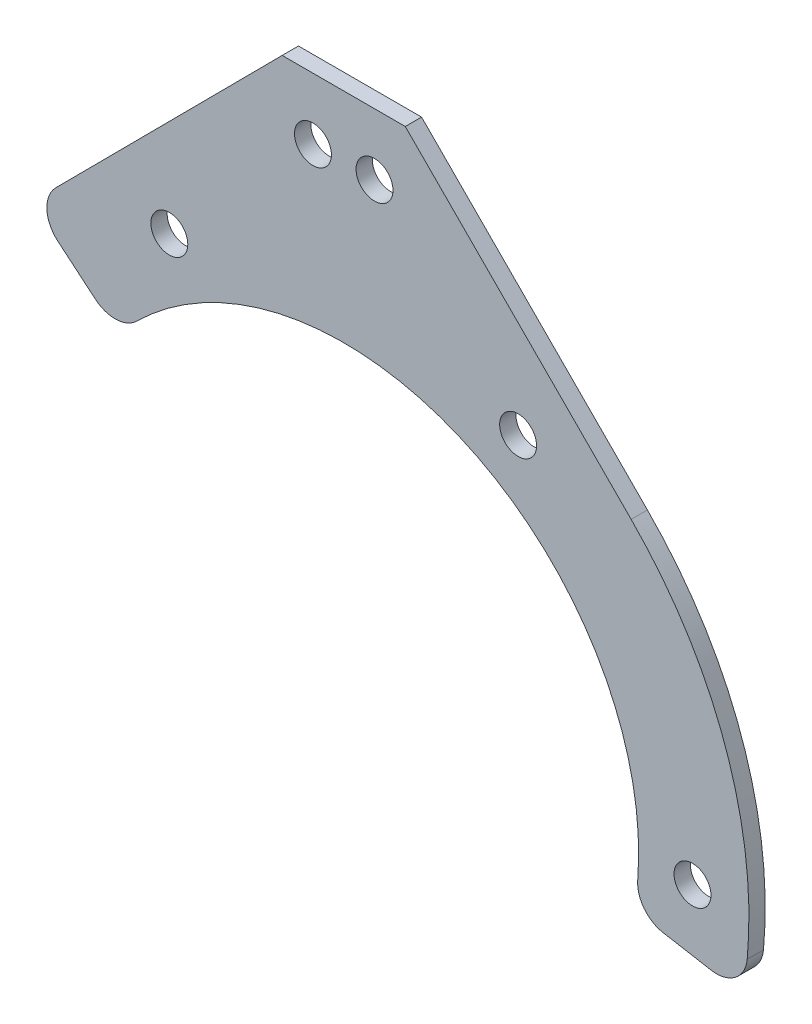
ISO-10303-21;
HEADER;
FILE_DESCRIPTION(('STEP AP214'),'2;1');
FILE_NAME('part.step','',(''),(''),'','','');
FILE_SCHEMA(('AUTOMOTIVE_DESIGN { 1 0 10303 214 1 1 1 1 }'));
ENDSEC;
DATA;
#1=APPLICATION_CONTEXT('core data for automotive mechanical design processes');
#2=APPLICATION_PROTOCOL_DEFINITION('international standard','automotive_design',2000,#1);
#3=PRODUCT_CONTEXT('',#1,'mechanical');
#4=PRODUCT('Part','Part','',(#3));
#5=PRODUCT_RELATED_PRODUCT_CATEGORY('part','',(#4));
#6=PRODUCT_DEFINITION_FORMATION('','',#4);
#7=PRODUCT_DEFINITION_CONTEXT('part definition',#1,'design');
#8=PRODUCT_DEFINITION('design','',#6,#7);
#9=PRODUCT_DEFINITION_SHAPE('','',#8);
#10=(LENGTH_UNIT() NAMED_UNIT(*) SI_UNIT(.MILLI.,.METRE.));
#11=(NAMED_UNIT(*) PLANE_ANGLE_UNIT() SI_UNIT($,.RADIAN.));
#12=(NAMED_UNIT(*) SI_UNIT($,.STERADIAN.) SOLID_ANGLE_UNIT());
#13=UNCERTAINTY_MEASURE_WITH_UNIT(LENGTH_MEASURE(1.E-05),#10,'distance_accuracy_value','');
#14=(GEOMETRIC_REPRESENTATION_CONTEXT(3) GLOBAL_UNCERTAINTY_ASSIGNED_CONTEXT((#13)) GLOBAL_UNIT_ASSIGNED_CONTEXT((#10,
#11,#12)) REPRESENTATION_CONTEXT('',''));
#15=CARTESIAN_POINT('',(0.,0.,0.));
#16=DIRECTION('',(0.,0.,1.));
#17=DIRECTION('',(1.,0.,0.));
#18=AXIS2_PLACEMENT_3D('',#15,#16,#17);
#19=CARTESIAN_POINT('',(0.,0.,0.79375));
#20=DIRECTION('',(0.,0.,-1.));
#21=DIRECTION('',(-1.,0.,0.));
#22=AXIS2_PLACEMENT_3D('',#19,#20,#21);
#23=CYLINDRICAL_SURFACE('',#22,39.5);
#24=CARTESIAN_POINT('',(0.,0.,-0.79375));
#25=DIRECTION('',(0.,0.,1.));
#26=DIRECTION('',(1.,0.,0.));
#27=AXIS2_PLACEMENT_3D('',#24,#25,#26);
#28=CIRCLE('',#27,39.5);
#29=CARTESIAN_POINT('',(-28.0183634295651,27.8427963884522,-0.79375));
#30=VERTEX_POINT('',#29);
#31=CARTESIAN_POINT('',(-28.0695175577032,27.7912249474144,-0.79375));
#32=VERTEX_POINT('',#31);
#33=EDGE_CURVE('E141',#30,#32,#28,.T.);
#34=ORIENTED_EDGE('',*,*,#33,.T.);
#35=DIRECTION('',(0.,0.,-1.));
#36=VECTOR('',#35,1.);
#37=CARTESIAN_POINT('',(-28.0695175577032,27.7912249474144,0.79375));
#38=LINE('',#37,#36);
#39=CARTESIAN_POINT('',(-28.0695175577032,27.7912249474144,0.79375));
#40=VERTEX_POINT('',#39);
#41=EDGE_CURVE('E11',#32,#40,#38,.F.);
#42=ORIENTED_EDGE('',*,*,#41,.T.);
#43=CARTESIAN_POINT('',(0.,0.,0.79375));
#44=DIRECTION('',(0.,0.,1.));
#45=DIRECTION('',(1.,0.,0.));
#46=AXIS2_PLACEMENT_3D('',#43,#44,#45);
#47=CIRCLE('',#46,39.5);
#48=CARTESIAN_POINT('',(-28.0183634295652,27.8427963884522,0.79375));
#49=VERTEX_POINT('',#48);
#50=EDGE_CURVE('E178',#49,#40,#47,.T.);
#51=ORIENTED_EDGE('',*,*,#50,.F.);
#52=DIRECTION('',(0.,0.,1.));
#53=VECTOR('',#52,1.);
#54=CARTESIAN_POINT('',(-28.0183634295651,27.8427963884522,-0.79375));
#55=LINE('',#54,#53);
#56=EDGE_CURVE('E142',#30,#49,#55,.T.);
#57=ORIENTED_EDGE('',*,*,#56,.F.);
#58=EDGE_LOOP('',(#34,#42,#51,#57));
#59=FACE_BOUND('',#58,.T.);
#60=ADVANCED_FACE('F40',(#59),#23,.T.);
#61=CARTESIAN_POINT('',(39.3320515344067,-3.63864289189977,0.79375));
#62=VERTEX_POINT('',#61);
#63=CARTESIAN_POINT('',(28.0183634295651,27.8427963884522,0.79375));
#64=VERTEX_POINT('',#63);
#65=EDGE_CURVE('E179',#62,#64,#47,.T.);
#66=ORIENTED_EDGE('',*,*,#65,.F.);
#67=DIRECTION('',(0.,0.,-1.));
#68=VECTOR('',#67,1.);
#69=CARTESIAN_POINT('',(39.3320515344067,-3.63864289189977,0.79375));
#70=LINE('',#69,#68);
#71=CARTESIAN_POINT('',(39.3320515344067,-3.63864289189977,-0.79375));
#72=VERTEX_POINT('',#71);
#73=EDGE_CURVE('E138',#62,#72,#70,.T.);
#74=ORIENTED_EDGE('',*,*,#73,.T.);
#75=CARTESIAN_POINT('',(28.0183634295651,27.8427963884522,-0.79375));
#76=VERTEX_POINT('',#75);
#77=EDGE_CURVE('E132',#72,#76,#28,.T.);
#78=ORIENTED_EDGE('',*,*,#77,.T.);
#79=DIRECTION('',(0.,0.,1.));
#80=VECTOR('',#79,1.);
#81=CARTESIAN_POINT('',(28.0183634295651,27.8427963884522,-0.79375));
#82=LINE('',#81,#80);
#83=EDGE_CURVE('E136',#76,#64,#82,.T.);
#84=ORIENTED_EDGE('',*,*,#83,.T.);
#85=EDGE_LOOP('',(#66,#74,#78,#84));
#86=FACE_BOUND('',#85,.T.);
#87=ADVANCED_FACE('F135',(#86),#23,.T.);
#88=CARTESIAN_POINT('',(0.,0.,0.79375));
#89=DIRECTION('',(0.,0.,1.));
#90=DIRECTION('',(1.,0.,0.));
#91=AXIS2_PLACEMENT_3D('',#88,#89,#90);
#92=PLANE('',#91);
#93=DIRECTION('',(0.984807753012209,-0.173648177666928,0.));
#94=VECTOR('',#93,1.);
#95=CARTESIAN_POINT('',(28.313222899101,-4.99238510792417,0.79375));
#96=LINE('',#95,#94);
#97=CARTESIAN_POINT('',(31.1277541669321,-5.48866290849039,0.79375));
#98=VERTEX_POINT('',#97);
#99=CARTESIAN_POINT('',(35.8238625810713,-6.31671352623515,0.79375));
#100=VERTEX_POINT('',#99);
#101=EDGE_CURVE('E231',#98,#100,#96,.T.);
#102=ORIENTED_EDGE('',*,*,#101,.T.);
#103=CARTESIAN_POINT('',(36.344807114072,-3.36229026719852,0.79375));
#104=DIRECTION('',(0.,0.,1.));
#105=DIRECTION('',(1.,0.,0.));
#106=AXIS2_PLACEMENT_3D('',#103,#104,#105);
#107=CIRCLE('',#106,3.);
#108=EDGE_CURVE('E209',#100,#62,#107,.T.);
#109=ORIENTED_EDGE('',*,*,#108,.T.);
#110=ORIENTED_EDGE('',*,*,#65,.T.);
#111=DIRECTION('',(-0.704880921226637,0.709325656444688,0.));
#112=VECTOR('',#111,1.);
#113=CARTESIAN_POINT('',(28.0183634295651,27.8427963884522,0.79375));
#114=LINE('',#113,#112);
#115=CARTESIAN_POINT('',(6.,50.,0.79375));
#116=VERTEX_POINT('',#115);
#117=EDGE_CURVE('E150',#64,#116,#114,.T.);
#118=ORIENTED_EDGE('',*,*,#117,.T.);
#119=DIRECTION('',(-1.,0.,0.));
#120=VECTOR('',#119,1.);
#121=CARTESIAN_POINT('',(-6.,50.,0.79375));
#122=LINE('',#121,#120);
#123=CARTESIAN_POINT('',(-6.,50.,0.79375));
#124=VERTEX_POINT('',#123);
#125=EDGE_CURVE('E162',#116,#124,#122,.T.);
#126=ORIENTED_EDGE('',*,*,#125,.T.);
#127=DIRECTION('',(-0.704880921226637,-0.709325656444688,0.));
#128=VECTOR('',#127,1.);
#129=CARTESIAN_POINT('',(-28.0183634295651,27.8427963884522,0.79375));
#130=LINE('',#129,#128);
#131=EDGE_CURVE('E159',#124,#49,#130,.T.);
#132=ORIENTED_EDGE('',*,*,#131,.T.);
#133=ORIENTED_EDGE('',*,*,#50,.T.);
#134=CARTESIAN_POINT('',(-25.9376554647131,25.6804990020412,0.79375));
#135=DIRECTION('',(0.,0.,1.));
#136=DIRECTION('',(1.,0.,0.));
#137=AXIS2_PLACEMENT_3D('',#134,#135,#136);
#138=CIRCLE('',#137,3.);
#139=CARTESIAN_POINT('',(-27.8660182937727,23.3823656726843,0.79375));
#140=VERTEX_POINT('',#139);
#141=EDGE_CURVE('E205',#40,#140,#138,.T.);
#142=ORIENTED_EDGE('',*,*,#141,.T.);
#143=DIRECTION('',(0.766044443118975,-0.642787609686543,0.));
#144=VECTOR('',#143,1.);
#145=CARTESIAN_POINT('',(-22.0237777396705,18.4801437784881,0.79375));
#146=LINE('',#145,#144);
#147=CARTESIAN_POINT('',(-24.2130944170748,20.3171985950283,0.79375));
#148=VERTEX_POINT('',#147);
#149=EDGE_CURVE('E226',#140,#148,#146,.T.);
#150=ORIENTED_EDGE('',*,*,#149,.T.);
#151=CARTESIAN_POINT('',(-22.2847315880152,22.6153319243852,0.79375));
#152=DIRECTION('',(0.,0.,1.));
#153=DIRECTION('',(1.,0.,0.));
#154=AXIS2_PLACEMENT_3D('',#151,#152,#153);
#155=CIRCLE('',#154,3.);
#156=CARTESIAN_POINT('',(-20.1790876584389,20.4784501677504,0.79375));
#157=VERTEX_POINT('',#156);
#158=EDGE_CURVE('E61',#148,#157,#155,.T.);
#159=ORIENTED_EDGE('',*,*,#158,.T.);
#160=CARTESIAN_POINT('',(0.,0.,0.79375));
#161=DIRECTION('',(0.,0.,1.));
#162=DIRECTION('',(1.,0.,0.));
#163=AXIS2_PLACEMENT_3D('',#160,#161,#162);
#164=CIRCLE('',#163,28.75);
#165=CARTESIAN_POINT('',(28.6582704763172,-2.29478393454475,0.79375));
#166=VERTEX_POINT('',#165);
#167=EDGE_CURVE('E165',#166,#157,#164,.T.);
#168=ORIENTED_EDGE('',*,*,#167,.F.);
#169=CARTESIAN_POINT('',(31.6486986999329,-2.53423964945377,0.79375));
#170=DIRECTION('',(0.,0.,1.));
#171=DIRECTION('',(1.,0.,0.));
#172=AXIS2_PLACEMENT_3D('',#169,#170,#171);
#173=CIRCLE('',#172,3.);
#174=EDGE_CURVE('E207',#166,#98,#173,.T.);
#175=ORIENTED_EDGE('',*,*,#174,.T.);
#176=EDGE_LOOP('',(#102,#109,#110,#118,#126,#132,#133,#142,#150,#159,#168,#175));
#177=FACE_BOUND('',#176,.T.);
#178=CARTESIAN_POINT('',(-3.,44.,0.79375));
#179=DIRECTION('',(0.,0.,1.));
#180=DIRECTION('',(1.,0.,0.));
#181=AXIS2_PLACEMENT_3D('',#178,#179,#180);
#182=CIRCLE('',#181,1.8);
#183=CARTESIAN_POINT('',(-1.2,44.,0.79375));
#184=VERTEX_POINT('',#183);
#185=EDGE_CURVE('E189',#184,#184,#182,.T.);
#186=ORIENTED_EDGE('',*,*,#185,.F.);
#187=EDGE_LOOP('',(#186));
#188=FACE_BOUND('',#187,.T.);
#189=CARTESIAN_POINT('',(3.,44.,0.79375));
#190=DIRECTION('',(0.,0.,1.));
#191=DIRECTION('',(1.,0.,0.));
#192=AXIS2_PLACEMENT_3D('',#189,#190,#191);
#193=CIRCLE('',#192,1.8);
#194=CARTESIAN_POINT('',(4.8,44.,0.79375));
#195=VERTEX_POINT('',#194);
#196=EDGE_CURVE('E185',#195,#195,#193,.T.);
#197=ORIENTED_EDGE('',*,*,#196,.F.);
#198=EDGE_LOOP('',(#197));
#199=FACE_BOUND('',#198,.T.);
#200=CARTESIAN_POINT('',(-17.,29.4448637286709,0.79375));
#201=DIRECTION('',(0.,0.,1.));
#202=DIRECTION('',(1.,0.,0.));
#203=AXIS2_PLACEMENT_3D('',#200,#201,#202);
#204=CIRCLE('',#203,1.8);
#205=CARTESIAN_POINT('',(-15.2000000000001,29.4448637286709,0.79375));
#206=VERTEX_POINT('',#205);
#207=EDGE_CURVE('E184',#206,#206,#204,.T.);
#208=ORIENTED_EDGE('',*,*,#207,.F.);
#209=EDGE_LOOP('',(#208));
#210=FACE_BOUND('',#209,.T.);
#211=CARTESIAN_POINT('',(16.9999999999998,29.444863728671,0.79375));
#212=DIRECTION('',(0.,0.,1.));
#213=DIRECTION('',(1.,0.,0.));
#214=AXIS2_PLACEMENT_3D('',#211,#212,#213);
#215=CIRCLE('',#214,1.8);
#216=CARTESIAN_POINT('',(18.7999999999998,29.444863728671,0.79375));
#217=VERTEX_POINT('',#216);
#218=EDGE_CURVE('E249',#217,#217,#215,.T.);
#219=ORIENTED_EDGE('',*,*,#218,.F.);
#220=EDGE_LOOP('',(#219));
#221=FACE_BOUND('',#220,.T.);
#222=CARTESIAN_POINT('',(34.,1.31838984174237E-13,0.79375));
#223=DIRECTION('',(0.,0.,1.));
#224=DIRECTION('',(1.,0.,0.));
#225=AXIS2_PLACEMENT_3D('',#222,#223,#224);
#226=CIRCLE('',#225,1.8);
#227=CARTESIAN_POINT('',(35.8,1.31838984174237E-13,0.79375));
#228=VERTEX_POINT('',#227);
#229=EDGE_CURVE('E255',#228,#228,#226,.T.);
#230=ORIENTED_EDGE('',*,*,#229,.F.);
#231=EDGE_LOOP('',(#230));
#232=FACE_BOUND('',#231,.T.);
#233=ADVANCED_FACE('F267',(#177,#188,#199,#210,#221,#232),#92,.T.);
#234=CARTESIAN_POINT('',(0.,0.,-0.79375));
#235=DIRECTION('',(0.,0.,1.));
#236=DIRECTION('',(1.,0.,0.));
#237=AXIS2_PLACEMENT_3D('',#234,#235,#236);
#238=PLANE('',#237);
#239=CARTESIAN_POINT('',(-3.,44.,-0.79375));
#240=DIRECTION('',(0.,0.,1.));
#241=DIRECTION('',(1.,0.,0.));
#242=AXIS2_PLACEMENT_3D('',#239,#240,#241);
#243=CIRCLE('',#242,1.8);
#244=CARTESIAN_POINT('',(-1.2,44.,-0.79375));
#245=VERTEX_POINT('',#244);
#246=EDGE_CURVE('E186',#245,#245,#243,.T.);
#247=ORIENTED_EDGE('',*,*,#246,.T.);
#248=EDGE_LOOP('',(#247));
#249=FACE_BOUND('',#248,.T.);
#250=CARTESIAN_POINT('',(3.,44.,-0.79375));
#251=DIRECTION('',(0.,0.,1.));
#252=DIRECTION('',(1.,0.,0.));
#253=AXIS2_PLACEMENT_3D('',#250,#251,#252);
#254=CIRCLE('',#253,1.8);
#255=CARTESIAN_POINT('',(4.8,44.,-0.79375));
#256=VERTEX_POINT('',#255);
#257=EDGE_CURVE('E181',#256,#256,#254,.T.);
#258=ORIENTED_EDGE('',*,*,#257,.T.);
#259=EDGE_LOOP('',(#258));
#260=FACE_BOUND('',#259,.T.);
#261=CARTESIAN_POINT('',(-17.,29.4448637286709,-0.79375));
#262=DIRECTION('',(0.,0.,1.));
#263=DIRECTION('',(1.,0.,0.));
#264=AXIS2_PLACEMENT_3D('',#261,#262,#263);
#265=CIRCLE('',#264,1.8);
#266=CARTESIAN_POINT('',(-15.2000000000001,29.4448637286709,-0.79375));
#267=VERTEX_POINT('',#266);
#268=EDGE_CURVE('E246',#267,#267,#265,.T.);
#269=ORIENTED_EDGE('',*,*,#268,.T.);
#270=EDGE_LOOP('',(#269));
#271=FACE_BOUND('',#270,.T.);
#272=CARTESIAN_POINT('',(16.9999999999998,29.444863728671,-0.79375));
#273=DIRECTION('',(0.,0.,1.));
#274=DIRECTION('',(1.,0.,0.));
#275=AXIS2_PLACEMENT_3D('',#272,#273,#274);
#276=CIRCLE('',#275,1.8);
#277=CARTESIAN_POINT('',(18.7999999999998,29.444863728671,-0.79375));
#278=VERTEX_POINT('',#277);
#279=EDGE_CURVE('E252',#278,#278,#276,.T.);
#280=ORIENTED_EDGE('',*,*,#279,.T.);
#281=EDGE_LOOP('',(#280));
#282=FACE_BOUND('',#281,.T.);
#283=CARTESIAN_POINT('',(34.,1.31838984174237E-13,-0.79375));
#284=DIRECTION('',(0.,0.,1.));
#285=DIRECTION('',(1.,0.,0.));
#286=AXIS2_PLACEMENT_3D('',#283,#284,#285);
#287=CIRCLE('',#286,1.8);
#288=CARTESIAN_POINT('',(35.8,1.31838984174237E-13,-0.79375));
#289=VERTEX_POINT('',#288);
#290=EDGE_CURVE('E258',#289,#289,#287,.T.);
#291=ORIENTED_EDGE('',*,*,#290,.T.);
#292=EDGE_LOOP('',(#291));
#293=FACE_BOUND('',#292,.T.);
#294=ORIENTED_EDGE('',*,*,#77,.F.);
#295=CARTESIAN_POINT('',(36.344807114072,-3.36229026719852,-0.79375));
#296=DIRECTION('',(0.,0.,1.));
#297=DIRECTION('',(1.,0.,0.));
#298=AXIS2_PLACEMENT_3D('',#295,#296,#297);
#299=CIRCLE('',#298,3.);
#300=CARTESIAN_POINT('',(35.8238625810713,-6.31671352623515,-0.79375));
#301=VERTEX_POINT('',#300);
#302=EDGE_CURVE('E197',#72,#301,#299,.F.);
#303=ORIENTED_EDGE('',*,*,#302,.T.);
#304=DIRECTION('',(0.984807753012209,-0.173648177666928,0.));
#305=VECTOR('',#304,1.);
#306=CARTESIAN_POINT('',(28.313222899101,-4.99238510792417,-0.79375));
#307=LINE('',#306,#305);
#308=CARTESIAN_POINT('',(31.1277541669321,-5.48866290849039,-0.79375));
#309=VERTEX_POINT('',#308);
#310=EDGE_CURVE('E232',#309,#301,#307,.T.);
#311=ORIENTED_EDGE('',*,*,#310,.F.);
#312=CARTESIAN_POINT('',(31.6486986999329,-2.53423964945377,-0.79375));
#313=DIRECTION('',(0.,0.,1.));
#314=DIRECTION('',(1.,0.,0.));
#315=AXIS2_PLACEMENT_3D('',#312,#313,#314);
#316=CIRCLE('',#315,3.);
#317=CARTESIAN_POINT('',(28.6582704763172,-2.29478393454475,-0.79375));
#318=VERTEX_POINT('',#317);
#319=EDGE_CURVE('E195',#309,#318,#316,.F.);
#320=ORIENTED_EDGE('',*,*,#319,.T.);
#321=CARTESIAN_POINT('',(0.,0.,-0.79375));
#322=DIRECTION('',(0.,0.,1.));
#323=DIRECTION('',(1.,0.,0.));
#324=AXIS2_PLACEMENT_3D('',#321,#322,#323);
#325=CIRCLE('',#324,28.75);
#326=CARTESIAN_POINT('',(-20.1790876584389,20.4784501677504,-0.79375));
#327=VERTEX_POINT('',#326);
#328=EDGE_CURVE('E170',#318,#327,#325,.T.);
#329=ORIENTED_EDGE('',*,*,#328,.T.);
#330=CARTESIAN_POINT('',(-22.2847315880152,22.6153319243852,-0.79375));
#331=DIRECTION('',(0.,0.,1.));
#332=DIRECTION('',(1.,0.,0.));
#333=AXIS2_PLACEMENT_3D('',#330,#331,#332);
#334=CIRCLE('',#333,3.);
#335=CARTESIAN_POINT('',(-24.2130944170748,20.3171985950283,-0.79375));
#336=VERTEX_POINT('',#335);
#337=EDGE_CURVE('E191',#327,#336,#334,.F.);
#338=ORIENTED_EDGE('',*,*,#337,.T.);
#339=DIRECTION('',(0.766044443118975,-0.642787609686543,0.));
#340=VECTOR('',#339,1.);
#341=CARTESIAN_POINT('',(-22.0237777396705,18.4801437784881,-0.79375));
#342=LINE('',#341,#340);
#343=CARTESIAN_POINT('',(-27.8660182937727,23.3823656726843,-0.79375));
#344=VERTEX_POINT('',#343);
#345=EDGE_CURVE('E224',#344,#336,#342,.T.);
#346=ORIENTED_EDGE('',*,*,#345,.F.);
#347=CARTESIAN_POINT('',(-25.9376554647131,25.6804990020412,-0.79375));
#348=DIRECTION('',(0.,0.,1.));
#349=DIRECTION('',(1.,0.,0.));
#350=AXIS2_PLACEMENT_3D('',#347,#348,#349);
#351=CIRCLE('',#350,3.);
#352=EDGE_CURVE('E193',#344,#32,#351,.F.);
#353=ORIENTED_EDGE('',*,*,#352,.T.);
#354=ORIENTED_EDGE('',*,*,#33,.F.);
#355=DIRECTION('',(-0.704880921226637,-0.709325656444688,0.));
#356=VECTOR('',#355,1.);
#357=CARTESIAN_POINT('',(-28.0183634295651,27.8427963884522,-0.79375));
#358=LINE('',#357,#356);
#359=CARTESIAN_POINT('',(-6.,50.,-0.79375));
#360=VERTEX_POINT('',#359);
#361=EDGE_CURVE('E152',#360,#30,#358,.T.);
#362=ORIENTED_EDGE('',*,*,#361,.F.);
#363=DIRECTION('',(-1.,0.,0.));
#364=VECTOR('',#363,1.);
#365=CARTESIAN_POINT('',(-6.,50.,-0.79375));
#366=LINE('',#365,#364);
#367=CARTESIAN_POINT('',(6.,50.,-0.79375));
#368=VERTEX_POINT('',#367);
#369=EDGE_CURVE('E158',#368,#360,#366,.T.);
#370=ORIENTED_EDGE('',*,*,#369,.F.);
#371=DIRECTION('',(-0.704880921226637,0.709325656444688,0.));
#372=VECTOR('',#371,1.);
#373=CARTESIAN_POINT('',(28.0183634295651,27.8427963884522,-0.79375));
#374=LINE('',#373,#372);
#375=EDGE_CURVE('E148',#76,#368,#374,.T.);
#376=ORIENTED_EDGE('',*,*,#375,.F.);
#377=EDGE_LOOP('',(#294,#303,#311,#320,#329,#338,#346,#353,#354,#362,#370,#376));
#378=FACE_BOUND('',#377,.T.);
#379=ADVANCED_FACE('F155',(#249,#260,#271,#282,#293,#378),#238,.F.);
#380=CARTESIAN_POINT('',(-28.0183634295651,27.8427963884522,-0.79375));
#381=DIRECTION('',(-0.709325656444688,0.704880921226637,0.));
#382=DIRECTION('',(-0.704880921226637,-0.709325656444688,0.));
#383=AXIS2_PLACEMENT_3D('',#380,#381,#382);
#384=PLANE('',#383);
#385=ORIENTED_EDGE('',*,*,#131,.F.);
#386=DIRECTION('',(0.,0.,1.));
#387=VECTOR('',#386,1.);
#388=CARTESIAN_POINT('',(-6.,50.,-0.79375));
#389=LINE('',#388,#387);
#390=EDGE_CURVE('E175',#360,#124,#389,.T.);
#391=ORIENTED_EDGE('',*,*,#390,.F.);
#392=ORIENTED_EDGE('',*,*,#361,.T.);
#393=ORIENTED_EDGE('',*,*,#56,.T.);
#394=EDGE_LOOP('',(#385,#391,#392,#393));
#395=FACE_BOUND('',#394,.T.);
#396=ADVANCED_FACE('F327',(#395),#384,.T.);
#397=CARTESIAN_POINT('',(-6.,50.,-0.79375));
#398=DIRECTION('',(0.,1.,0.));
#399=DIRECTION('',(0.,0.,1.));
#400=AXIS2_PLACEMENT_3D('',#397,#398,#399);
#401=PLANE('',#400);
#402=ORIENTED_EDGE('',*,*,#125,.F.);
#403=DIRECTION('',(0.,0.,1.));
#404=VECTOR('',#403,1.);
#405=CARTESIAN_POINT('',(6.,50.,-0.79375));
#406=LINE('',#405,#404);
#407=EDGE_CURVE('E151',#368,#116,#406,.T.);
#408=ORIENTED_EDGE('',*,*,#407,.F.);
#409=ORIENTED_EDGE('',*,*,#369,.T.);
#410=ORIENTED_EDGE('',*,*,#390,.T.);
#411=EDGE_LOOP('',(#402,#408,#409,#410));
#412=FACE_BOUND('',#411,.T.);
#413=ADVANCED_FACE('F330',(#412),#401,.T.);
#414=CARTESIAN_POINT('',(28.0183634295651,27.8427963884522,-0.79375));
#415=DIRECTION('',(0.709325656444688,0.704880921226637,0.));
#416=DIRECTION('',(-0.704880921226637,0.709325656444688,0.));
#417=AXIS2_PLACEMENT_3D('',#414,#415,#416);
#418=PLANE('',#417);
#419=ORIENTED_EDGE('',*,*,#117,.F.);
#420=ORIENTED_EDGE('',*,*,#83,.F.);
#421=ORIENTED_EDGE('',*,*,#375,.T.);
#422=ORIENTED_EDGE('',*,*,#407,.T.);
#423=EDGE_LOOP('',(#419,#420,#421,#422));
#424=FACE_BOUND('',#423,.T.);
#425=ADVANCED_FACE('F147',(#424),#418,.T.);
#426=CARTESIAN_POINT('',(0.,0.,-0.79375));
#427=DIRECTION('',(0.,0.,1.));
#428=DIRECTION('',(1.,0.,0.));
#429=AXIS2_PLACEMENT_3D('',#426,#427,#428);
#430=CYLINDRICAL_SURFACE('',#429,28.75);
#431=ORIENTED_EDGE('',*,*,#328,.F.);
#432=DIRECTION('',(0.,0.,1.));
#433=VECTOR('',#432,1.);
#434=CARTESIAN_POINT('',(28.6582704763172,-2.29478393454475,-0.79375));
#435=LINE('',#434,#433);
#436=EDGE_CURVE('E214',#318,#166,#435,.T.);
#437=ORIENTED_EDGE('',*,*,#436,.T.);
#438=ORIENTED_EDGE('',*,*,#167,.T.);
#439=DIRECTION('',(0.,0.,1.));
#440=VECTOR('',#439,1.);
#441=CARTESIAN_POINT('',(-20.1790876584389,20.4784501677504,-0.79375));
#442=LINE('',#441,#440);
#443=EDGE_CURVE('E211',#157,#327,#442,.F.);
#444=ORIENTED_EDGE('',*,*,#443,.T.);
#445=EDGE_LOOP('',(#431,#437,#438,#444));
#446=FACE_BOUND('',#445,.T.);
#447=ADVANCED_FACE('F263',(#446),#430,.F.);
#448=CARTESIAN_POINT('',(34.,1.31838984174237E-13,0.79375));
#449=DIRECTION('',(0.,0.,1.));
#450=DIRECTION('',(1.,0.,0.));
#451=AXIS2_PLACEMENT_3D('',#448,#449,#450);
#452=CYLINDRICAL_SURFACE('',#451,1.8);
#453=ORIENTED_EDGE('',*,*,#290,.F.);
#454=EDGE_LOOP('',(#453));
#455=FACE_BOUND('',#454,.T.);
#456=ORIENTED_EDGE('',*,*,#229,.T.);
#457=EDGE_LOOP('',(#456));
#458=FACE_BOUND('',#457,.T.);
#459=ADVANCED_FACE('F320',(#455,#458),#452,.F.);
#460=CARTESIAN_POINT('',(16.9999999999998,29.444863728671,0.79375));
#461=DIRECTION('',(0.,0.,1.));
#462=DIRECTION('',(1.,0.,0.));
#463=AXIS2_PLACEMENT_3D('',#460,#461,#462);
#464=CYLINDRICAL_SURFACE('',#463,1.8);
#465=ORIENTED_EDGE('',*,*,#279,.F.);
#466=EDGE_LOOP('',(#465));
#467=FACE_BOUND('',#466,.T.);
#468=ORIENTED_EDGE('',*,*,#218,.T.);
#469=EDGE_LOOP('',(#468));
#470=FACE_BOUND('',#469,.T.);
#471=ADVANCED_FACE('F316',(#467,#470),#464,.F.);
#472=CARTESIAN_POINT('',(-17.,29.4448637286709,0.79375));
#473=DIRECTION('',(0.,0.,1.));
#474=DIRECTION('',(1.,0.,0.));
#475=AXIS2_PLACEMENT_3D('',#472,#473,#474);
#476=CYLINDRICAL_SURFACE('',#475,1.8);
#477=ORIENTED_EDGE('',*,*,#268,.F.);
#478=EDGE_LOOP('',(#477));
#479=FACE_BOUND('',#478,.T.);
#480=ORIENTED_EDGE('',*,*,#207,.T.);
#481=EDGE_LOOP('',(#480));
#482=FACE_BOUND('',#481,.T.);
#483=ADVANCED_FACE('F312',(#479,#482),#476,.F.);
#484=CARTESIAN_POINT('',(3.,44.,0.79375));
#485=DIRECTION('',(0.,0.,1.));
#486=DIRECTION('',(1.,0.,0.));
#487=AXIS2_PLACEMENT_3D('',#484,#485,#486);
#488=CYLINDRICAL_SURFACE('',#487,1.8);
#489=ORIENTED_EDGE('',*,*,#196,.T.);
#490=EDGE_LOOP('',(#489));
#491=FACE_BOUND('',#490,.T.);
#492=ORIENTED_EDGE('',*,*,#257,.F.);
#493=EDGE_LOOP('',(#492));
#494=FACE_BOUND('',#493,.T.);
#495=ADVANCED_FACE('F306',(#491,#494),#488,.F.);
#496=CARTESIAN_POINT('',(-3.,44.,0.79375));
#497=DIRECTION('',(0.,0.,1.));
#498=DIRECTION('',(1.,0.,0.));
#499=AXIS2_PLACEMENT_3D('',#496,#497,#498);
#500=CYLINDRICAL_SURFACE('',#499,1.8);
#501=ORIENTED_EDGE('',*,*,#185,.T.);
#502=EDGE_LOOP('',(#501));
#503=FACE_BOUND('',#502,.T.);
#504=ORIENTED_EDGE('',*,*,#246,.F.);
#505=EDGE_LOOP('',(#504));
#506=FACE_BOUND('',#505,.T.);
#507=ADVANCED_FACE('F301',(#503,#506),#500,.F.);
#508=CARTESIAN_POINT('',(28.313222899101,-4.99238510792417,0.79375));
#509=DIRECTION('',(0.173648177666928,0.984807753012209,0.));
#510=DIRECTION('',(-0.984807753012209,0.173648177666928,0.));
#511=AXIS2_PLACEMENT_3D('',#508,#509,#510);
#512=PLANE('',#511);
#513=ORIENTED_EDGE('',*,*,#310,.T.);
#514=DIRECTION('',(0.,0.,-1.));
#515=VECTOR('',#514,1.);
#516=CARTESIAN_POINT('',(35.8238625810713,-6.31671352623515,0.79375));
#517=LINE('',#516,#515);
#518=EDGE_CURVE('E202',#301,#100,#517,.F.);
#519=ORIENTED_EDGE('',*,*,#518,.T.);
#520=ORIENTED_EDGE('',*,*,#101,.F.);
#521=DIRECTION('',(0.,0.,1.));
#522=VECTOR('',#521,1.);
#523=CARTESIAN_POINT('',(31.1277541669321,-5.48866290849039,0.79375));
#524=LINE('',#523,#522);
#525=EDGE_CURVE('E199',#98,#309,#524,.F.);
#526=ORIENTED_EDGE('',*,*,#525,.T.);
#527=EDGE_LOOP('',(#513,#519,#520,#526));
#528=FACE_BOUND('',#527,.T.);
#529=ADVANCED_FACE('F292',(#528),#512,.F.);
#530=CARTESIAN_POINT('',(-22.0237777396705,18.4801437784881,0.79375));
#531=DIRECTION('',(0.642787609686543,0.766044443118975,0.));
#532=DIRECTION('',(-0.766044443118975,0.642787609686543,0.));
#533=AXIS2_PLACEMENT_3D('',#530,#531,#532);
#534=PLANE('',#533);
#535=ORIENTED_EDGE('',*,*,#149,.F.);
#536=DIRECTION('',(0.,0.,-1.));
#537=VECTOR('',#536,1.);
#538=CARTESIAN_POINT('',(-27.8660182937727,23.3823656726843,0.79375));
#539=LINE('',#538,#537);
#540=EDGE_CURVE('E48',#140,#344,#539,.T.);
#541=ORIENTED_EDGE('',*,*,#540,.T.);
#542=ORIENTED_EDGE('',*,*,#345,.T.);
#543=DIRECTION('',(0.,0.,1.));
#544=VECTOR('',#543,1.);
#545=CARTESIAN_POINT('',(-24.2130944170748,20.3171985950283,0.79375));
#546=LINE('',#545,#544);
#547=EDGE_CURVE('E216',#336,#148,#546,.T.);
#548=ORIENTED_EDGE('',*,*,#547,.T.);
#549=EDGE_LOOP('',(#535,#541,#542,#548));
#550=FACE_BOUND('',#549,.T.);
#551=ADVANCED_FACE('F223',(#550),#534,.F.);
#552=CARTESIAN_POINT('',(36.344807114072,-3.36229026719852,0.79375));
#553=DIRECTION('',(0.,0.,-1.));
#554=DIRECTION('',(-1.,0.,0.));
#555=AXIS2_PLACEMENT_3D('',#552,#553,#554);
#556=CYLINDRICAL_SURFACE('',#555,3.);
#557=ORIENTED_EDGE('',*,*,#108,.F.);
#558=ORIENTED_EDGE('',*,*,#518,.F.);
#559=ORIENTED_EDGE('',*,*,#302,.F.);
#560=ORIENTED_EDGE('',*,*,#73,.F.);
#561=EDGE_LOOP('',(#557,#558,#559,#560));
#562=FACE_BOUND('',#561,.T.);
#563=ADVANCED_FACE('F276',(#562),#556,.T.);
#564=CARTESIAN_POINT('',(31.6486986999329,-2.53423964945377,-0.79375));
#565=DIRECTION('',(0.,0.,1.));
#566=DIRECTION('',(1.,0.,0.));
#567=AXIS2_PLACEMENT_3D('',#564,#565,#566);
#568=CYLINDRICAL_SURFACE('',#567,3.);
#569=ORIENTED_EDGE('',*,*,#174,.F.);
#570=ORIENTED_EDGE('',*,*,#436,.F.);
#571=ORIENTED_EDGE('',*,*,#319,.F.);
#572=ORIENTED_EDGE('',*,*,#525,.F.);
#573=EDGE_LOOP('',(#569,#570,#571,#572));
#574=FACE_BOUND('',#573,.T.);
#575=ADVANCED_FACE('F271',(#574),#568,.T.);
#576=CARTESIAN_POINT('',(-25.9376554647131,25.6804990020412,0.79375));
#577=DIRECTION('',(0.,0.,-1.));
#578=DIRECTION('',(-1.,0.,0.));
#579=AXIS2_PLACEMENT_3D('',#576,#577,#578);
#580=CYLINDRICAL_SURFACE('',#579,3.);
#581=ORIENTED_EDGE('',*,*,#141,.F.);
#582=ORIENTED_EDGE('',*,*,#41,.F.);
#583=ORIENTED_EDGE('',*,*,#352,.F.);
#584=ORIENTED_EDGE('',*,*,#540,.F.);
#585=EDGE_LOOP('',(#581,#582,#583,#584));
#586=FACE_BOUND('',#585,.T.);
#587=ADVANCED_FACE('F269',(#586),#580,.T.);
#588=CARTESIAN_POINT('',(-22.2847315880152,22.6153319243852,-0.79375));
#589=DIRECTION('',(0.,0.,1.));
#590=DIRECTION('',(1.,0.,0.));
#591=AXIS2_PLACEMENT_3D('',#588,#589,#590);
#592=CYLINDRICAL_SURFACE('',#591,3.);
#593=ORIENTED_EDGE('',*,*,#158,.F.);
#594=ORIENTED_EDGE('',*,*,#547,.F.);
#595=ORIENTED_EDGE('',*,*,#337,.F.);
#596=ORIENTED_EDGE('',*,*,#443,.F.);
#597=EDGE_LOOP('',(#593,#594,#595,#596));
#598=FACE_BOUND('',#597,.T.);
#599=ADVANCED_FACE('F42',(#598),#592,.T.);
#600=CLOSED_SHELL('',(#60,#87,#233,#379,#396,#413,#425,#447,#459,#471,#483,#495,#507,#529,#551,
#563,#575,#587,#599));
#601=MANIFOLD_SOLID_BREP('B2',#600);
#602=ADVANCED_BREP_SHAPE_REPRESENTATION('',(#18,#601),#14);
#603=SHAPE_DEFINITION_REPRESENTATION(#9,#602);
ENDSEC;
END-ISO-10303-21;
